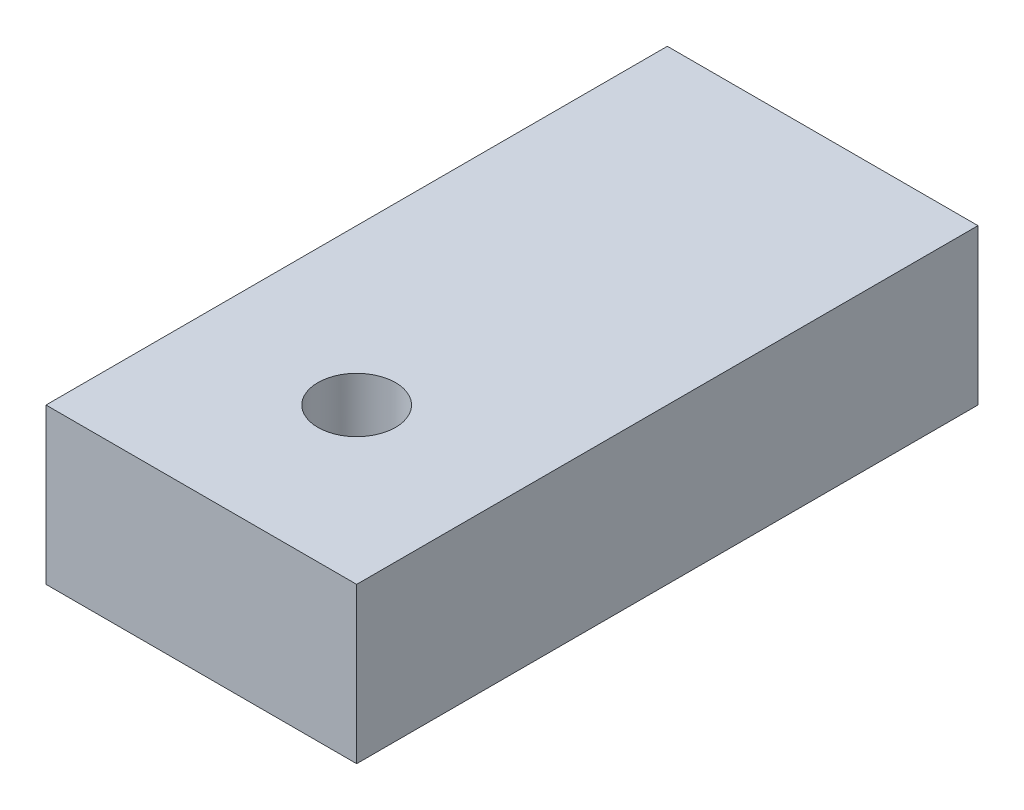
ISO-10303-21;
HEADER;
FILE_DESCRIPTION(('STEP AP214'),'2;1');
FILE_NAME('part.step','',(''),(''),'','','');
FILE_SCHEMA(('AUTOMOTIVE_DESIGN { 1 0 10303 214 1 1 1 1 }'));
ENDSEC;
DATA;
#1=APPLICATION_CONTEXT('core data for automotive mechanical design processes');
#2=APPLICATION_PROTOCOL_DEFINITION('international standard','automotive_design',2000,#1);
#3=PRODUCT_CONTEXT('',#1,'mechanical');
#4=PRODUCT('Part','Part','',(#3));
#5=PRODUCT_RELATED_PRODUCT_CATEGORY('part','',(#4));
#6=PRODUCT_DEFINITION_FORMATION('','',#4);
#7=PRODUCT_DEFINITION_CONTEXT('part definition',#1,'design');
#8=PRODUCT_DEFINITION('design','',#6,#7);
#9=PRODUCT_DEFINITION_SHAPE('','',#8);
#10=(LENGTH_UNIT() NAMED_UNIT(*) SI_UNIT(.MILLI.,.METRE.));
#11=(NAMED_UNIT(*) PLANE_ANGLE_UNIT() SI_UNIT($,.RADIAN.));
#12=(NAMED_UNIT(*) SI_UNIT($,.STERADIAN.) SOLID_ANGLE_UNIT());
#13=UNCERTAINTY_MEASURE_WITH_UNIT(LENGTH_MEASURE(1.E-05),#10,'distance_accuracy_value','');
#14=(GEOMETRIC_REPRESENTATION_CONTEXT(3) GLOBAL_UNCERTAINTY_ASSIGNED_CONTEXT((#13)) GLOBAL_UNIT_ASSIGNED_CONTEXT((#10,
#11,#12)) REPRESENTATION_CONTEXT('',''));
#15=CARTESIAN_POINT('',(0.,0.,0.));
#16=DIRECTION('',(0.,0.,1.));
#17=DIRECTION('',(1.,0.,0.));
#18=AXIS2_PLACEMENT_3D('',#15,#16,#17);
#19=CARTESIAN_POINT('',(0.,0.,101.6));
#20=DIRECTION('',(1.,0.,0.));
#21=DIRECTION('',(0.,0.,-1.));
#22=AXIS2_PLACEMENT_3D('',#19,#20,#21);
#23=PLANE('',#22);
#24=DIRECTION('',(0.,-1.,0.));
#25=VECTOR('',#24,1.);
#26=CARTESIAN_POINT('',(0.,0.,0.));
#27=LINE('',#26,#25);
#28=CARTESIAN_POINT('',(0.,25.4,0.));
#29=VERTEX_POINT('',#28);
#30=CARTESIAN_POINT('',(0.,0.,0.));
#31=VERTEX_POINT('',#30);
#32=EDGE_CURVE('E98',#29,#31,#27,.T.);
#33=ORIENTED_EDGE('',*,*,#32,.T.);
#34=DIRECTION('',(0.,0.,-1.));
#35=VECTOR('',#34,1.);
#36=CARTESIAN_POINT('',(0.,0.,101.6));
#37=LINE('',#36,#35);
#38=CARTESIAN_POINT('',(0.,0.,101.6));
#39=VERTEX_POINT('',#38);
#40=EDGE_CURVE('E11',#39,#31,#37,.T.);
#41=ORIENTED_EDGE('',*,*,#40,.F.);
#42=DIRECTION('',(0.,-1.,0.));
#43=VECTOR('',#42,1.);
#44=CARTESIAN_POINT('',(0.,0.,101.6));
#45=LINE('',#44,#43);
#46=CARTESIAN_POINT('',(0.,25.4,101.6));
#47=VERTEX_POINT('',#46);
#48=EDGE_CURVE('E85',#47,#39,#45,.T.);
#49=ORIENTED_EDGE('',*,*,#48,.F.);
#50=DIRECTION('',(0.,0.,-1.));
#51=VECTOR('',#50,1.);
#52=CARTESIAN_POINT('',(0.,25.4,101.6));
#53=LINE('',#52,#51);
#54=EDGE_CURVE('E94',#47,#29,#53,.T.);
#55=ORIENTED_EDGE('',*,*,#54,.T.);
#56=EDGE_LOOP('',(#33,#41,#49,#55));
#57=FACE_BOUND('',#56,.T.);
#58=ADVANCED_FACE('F33',(#57),#23,.F.);
#59=CARTESIAN_POINT('',(0.,0.,101.6));
#60=DIRECTION('',(0.,1.,0.));
#61=DIRECTION('',(0.,0.,1.));
#62=AXIS2_PLACEMENT_3D('',#59,#60,#61);
#63=PLANE('',#62);
#64=CARTESIAN_POINT('',(25.4,0.,76.2));
#65=DIRECTION('',(0.,1.,0.));
#66=DIRECTION('',(0.,0.,1.));
#67=AXIS2_PLACEMENT_3D('',#64,#65,#66);
#68=CIRCLE('',#67,6.35);
#69=CARTESIAN_POINT('',(25.4,0.,82.55));
#70=VERTEX_POINT('',#69);
#71=EDGE_CURVE('E111',#70,#70,#68,.T.);
#72=ORIENTED_EDGE('',*,*,#71,.T.);
#73=EDGE_LOOP('',(#72));
#74=FACE_BOUND('',#73,.T.);
#75=DIRECTION('',(1.,0.,0.));
#76=VECTOR('',#75,1.);
#77=CARTESIAN_POINT('',(0.,0.,0.));
#78=LINE('',#77,#76);
#79=CARTESIAN_POINT('',(50.8,0.,0.));
#80=VERTEX_POINT('',#79);
#81=EDGE_CURVE('E89',#31,#80,#78,.T.);
#82=ORIENTED_EDGE('',*,*,#81,.T.);
#83=DIRECTION('',(0.,0.,-1.));
#84=VECTOR('',#83,1.);
#85=CARTESIAN_POINT('',(50.8,0.,101.6));
#86=LINE('',#85,#84);
#87=CARTESIAN_POINT('',(50.8,0.,101.6));
#88=VERTEX_POINT('',#87);
#89=EDGE_CURVE('E42',#88,#80,#86,.T.);
#90=ORIENTED_EDGE('',*,*,#89,.F.);
#91=DIRECTION('',(1.,0.,0.));
#92=VECTOR('',#91,1.);
#93=CARTESIAN_POINT('',(0.,0.,101.6));
#94=LINE('',#93,#92);
#95=EDGE_CURVE('E80',#39,#88,#94,.T.);
#96=ORIENTED_EDGE('',*,*,#95,.F.);
#97=ORIENTED_EDGE('',*,*,#40,.T.);
#98=EDGE_LOOP('',(#82,#90,#96,#97));
#99=FACE_BOUND('',#98,.T.);
#100=ADVANCED_FACE('F88',(#74,#99),#63,.F.);
#101=CARTESIAN_POINT('',(50.8,0.,101.6));
#102=DIRECTION('',(-1.,0.,0.));
#103=DIRECTION('',(0.,0.,1.));
#104=AXIS2_PLACEMENT_3D('',#101,#102,#103);
#105=PLANE('',#104);
#106=DIRECTION('',(0.,1.,0.));
#107=VECTOR('',#106,1.);
#108=CARTESIAN_POINT('',(50.8,0.,0.));
#109=LINE('',#108,#107);
#110=CARTESIAN_POINT('',(50.8,25.4,0.));
#111=VERTEX_POINT('',#110);
#112=EDGE_CURVE('E67',#80,#111,#109,.T.);
#113=ORIENTED_EDGE('',*,*,#112,.T.);
#114=DIRECTION('',(0.,0.,-1.));
#115=VECTOR('',#114,1.);
#116=CARTESIAN_POINT('',(50.8,25.4,101.6));
#117=LINE('',#116,#115);
#118=CARTESIAN_POINT('',(50.8,25.4,101.6));
#119=VERTEX_POINT('',#118);
#120=EDGE_CURVE('E90',#119,#111,#117,.T.);
#121=ORIENTED_EDGE('',*,*,#120,.F.);
#122=DIRECTION('',(0.,1.,0.));
#123=VECTOR('',#122,1.);
#124=CARTESIAN_POINT('',(50.8,0.,101.6));
#125=LINE('',#124,#123);
#126=EDGE_CURVE('E83',#88,#119,#125,.T.);
#127=ORIENTED_EDGE('',*,*,#126,.F.);
#128=ORIENTED_EDGE('',*,*,#89,.T.);
#129=EDGE_LOOP('',(#113,#121,#127,#128));
#130=FACE_BOUND('',#129,.T.);
#131=ADVANCED_FACE('F92',(#130),#105,.F.);
#132=CARTESIAN_POINT('',(0.,25.4,101.6));
#133=DIRECTION('',(0.,-1.,0.));
#134=DIRECTION('',(0.,0.,-1.));
#135=AXIS2_PLACEMENT_3D('',#132,#133,#134);
#136=PLANE('',#135);
#137=CARTESIAN_POINT('',(25.4,25.4,76.2));
#138=DIRECTION('',(0.,-1.,0.));
#139=DIRECTION('',(0.,0.,-1.));
#140=AXIS2_PLACEMENT_3D('',#137,#138,#139);
#141=CIRCLE('',#140,6.35);
#142=CARTESIAN_POINT('',(25.4,25.4,69.85));
#143=VERTEX_POINT('',#142);
#144=EDGE_CURVE('E36',#143,#143,#141,.T.);
#145=ORIENTED_EDGE('',*,*,#144,.T.);
#146=EDGE_LOOP('',(#145));
#147=FACE_BOUND('',#146,.T.);
#148=DIRECTION('',(-1.,0.,0.));
#149=VECTOR('',#148,1.);
#150=CARTESIAN_POINT('',(0.,25.4,0.));
#151=LINE('',#150,#149);
#152=EDGE_CURVE('E73',#111,#29,#151,.T.);
#153=ORIENTED_EDGE('',*,*,#152,.T.);
#154=ORIENTED_EDGE('',*,*,#54,.F.);
#155=DIRECTION('',(-1.,0.,0.));
#156=VECTOR('',#155,1.);
#157=CARTESIAN_POINT('',(0.,25.4,101.6));
#158=LINE('',#157,#156);
#159=EDGE_CURVE('E50',#119,#47,#158,.T.);
#160=ORIENTED_EDGE('',*,*,#159,.F.);
#161=ORIENTED_EDGE('',*,*,#120,.T.);
#162=EDGE_LOOP('',(#153,#154,#160,#161));
#163=FACE_BOUND('',#162,.T.);
#164=ADVANCED_FACE('F105',(#147,#163),#136,.F.);
#165=CARTESIAN_POINT('',(0.,0.,101.6));
#166=DIRECTION('',(0.,0.,-1.));
#167=DIRECTION('',(-1.,0.,0.));
#168=AXIS2_PLACEMENT_3D('',#165,#166,#167);
#169=PLANE('',#168);
#170=ORIENTED_EDGE('',*,*,#48,.T.);
#171=ORIENTED_EDGE('',*,*,#95,.T.);
#172=ORIENTED_EDGE('',*,*,#126,.T.);
#173=ORIENTED_EDGE('',*,*,#159,.T.);
#174=EDGE_LOOP('',(#170,#171,#172,#173));
#175=FACE_BOUND('',#174,.T.);
#176=ADVANCED_FACE('F81',(#175),#169,.F.);
#177=CARTESIAN_POINT('',(0.,0.,0.));
#178=DIRECTION('',(0.,0.,-1.));
#179=DIRECTION('',(-1.,0.,0.));
#180=AXIS2_PLACEMENT_3D('',#177,#178,#179);
#181=PLANE('',#180);
#182=ORIENTED_EDGE('',*,*,#32,.F.);
#183=ORIENTED_EDGE('',*,*,#152,.F.);
#184=ORIENTED_EDGE('',*,*,#112,.F.);
#185=ORIENTED_EDGE('',*,*,#81,.F.);
#186=EDGE_LOOP('',(#182,#183,#184,#185));
#187=FACE_BOUND('',#186,.T.);
#188=ADVANCED_FACE('F108',(#187),#181,.T.);
#189=CARTESIAN_POINT('',(25.4,0.,76.2));
#190=DIRECTION('',(0.,1.,0.));
#191=DIRECTION('',(0.,0.,1.));
#192=AXIS2_PLACEMENT_3D('',#189,#190,#191);
#193=CYLINDRICAL_SURFACE('',#192,6.35);
#194=ORIENTED_EDGE('',*,*,#71,.F.);
#195=EDGE_LOOP('',(#194));
#196=FACE_BOUND('',#195,.T.);
#197=ORIENTED_EDGE('',*,*,#144,.F.);
#198=EDGE_LOOP('',(#197));
#199=FACE_BOUND('',#198,.T.);
#200=ADVANCED_FACE('F119',(#196,#199),#193,.F.);
#201=CLOSED_SHELL('',(#58,#100,#131,#164,#176,#188,#200));
#202=MANIFOLD_SOLID_BREP('B2',#201);
#203=ADVANCED_BREP_SHAPE_REPRESENTATION('',(#18,#202),#14);
#204=SHAPE_DEFINITION_REPRESENTATION(#9,#203);
ENDSEC;
END-ISO-10303-21;
